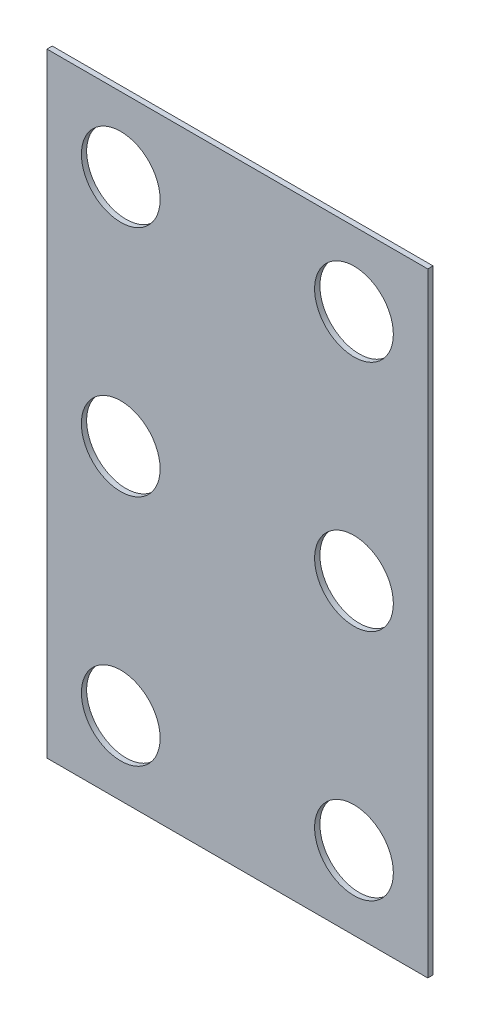
ISO-10303-21;
HEADER;
FILE_DESCRIPTION(('STEP AP214'),'2;1');
FILE_NAME('part.step','',(''),(''),'','','');
FILE_SCHEMA(('AUTOMOTIVE_DESIGN { 1 0 10303 214 1 1 1 1 }'));
ENDSEC;
DATA;
#1=APPLICATION_CONTEXT('core data for automotive mechanical design processes');
#2=APPLICATION_PROTOCOL_DEFINITION('international standard','automotive_design',2000,#1);
#3=PRODUCT_CONTEXT('',#1,'mechanical');
#4=PRODUCT('Part','Part','',(#3));
#5=PRODUCT_RELATED_PRODUCT_CATEGORY('part','',(#4));
#6=PRODUCT_DEFINITION_FORMATION('','',#4);
#7=PRODUCT_DEFINITION_CONTEXT('part definition',#1,'design');
#8=PRODUCT_DEFINITION('design','',#6,#7);
#9=PRODUCT_DEFINITION_SHAPE('','',#8);
#10=(LENGTH_UNIT() NAMED_UNIT(*) SI_UNIT(.MILLI.,.METRE.));
#11=(NAMED_UNIT(*) PLANE_ANGLE_UNIT() SI_UNIT($,.RADIAN.));
#12=(NAMED_UNIT(*) SI_UNIT($,.STERADIAN.) SOLID_ANGLE_UNIT());
#13=UNCERTAINTY_MEASURE_WITH_UNIT(LENGTH_MEASURE(1.E-05),#10,'distance_accuracy_value','');
#14=(GEOMETRIC_REPRESENTATION_CONTEXT(3) GLOBAL_UNCERTAINTY_ASSIGNED_CONTEXT((#13)) GLOBAL_UNIT_ASSIGNED_CONTEXT((#10,
#11,#12)) REPRESENTATION_CONTEXT('',''));
#15=CARTESIAN_POINT('',(0.,0.,0.));
#16=DIRECTION('',(0.,0.,1.));
#17=DIRECTION('',(1.,0.,0.));
#18=AXIS2_PLACEMENT_3D('',#15,#16,#17);
#19=CARTESIAN_POINT('',(0.,0.,0.46));
#20=DIRECTION('',(0.,0.,-1.));
#21=DIRECTION('',(-1.,0.,0.));
#22=AXIS2_PLACEMENT_3D('',#19,#20,#21);
#23=PLANE('',#22);
#24=DIRECTION('',(0.,-1.,0.));
#25=VECTOR('',#24,1.);
#26=CARTESIAN_POINT('',(0.,0.,0.46));
#27=LINE('',#26,#25);
#28=CARTESIAN_POINT('',(0.,53.5,0.46));
#29=VERTEX_POINT('',#28);
#30=CARTESIAN_POINT('',(0.,0.,0.46));
#31=VERTEX_POINT('',#30);
#32=EDGE_CURVE('E98',#29,#31,#27,.T.);
#33=ORIENTED_EDGE('',*,*,#32,.T.);
#34=DIRECTION('',(1.,0.,0.));
#35=VECTOR('',#34,1.);
#36=CARTESIAN_POINT('',(0.,0.,0.46));
#37=LINE('',#36,#35);
#38=CARTESIAN_POINT('',(33.18,0.,0.46));
#39=VERTEX_POINT('',#38);
#40=EDGE_CURVE('E93',#31,#39,#37,.T.);
#41=ORIENTED_EDGE('',*,*,#40,.T.);
#42=DIRECTION('',(0.,1.,0.));
#43=VECTOR('',#42,1.);
#44=CARTESIAN_POINT('',(33.18,0.,0.46));
#45=LINE('',#44,#43);
#46=CARTESIAN_POINT('',(33.18,53.5,0.46));
#47=VERTEX_POINT('',#46);
#48=EDGE_CURVE('E96',#39,#47,#45,.T.);
#49=ORIENTED_EDGE('',*,*,#48,.T.);
#50=DIRECTION('',(-1.,0.,0.));
#51=VECTOR('',#50,1.);
#52=CARTESIAN_POINT('',(0.,53.5,0.46));
#53=LINE('',#52,#51);
#54=EDGE_CURVE('E63',#47,#29,#53,.T.);
#55=ORIENTED_EDGE('',*,*,#54,.T.);
#56=EDGE_LOOP('',(#33,#41,#49,#55));
#57=FACE_BOUND('',#56,.T.);
#58=CARTESIAN_POINT('',(6.43,47.07,0.46));
#59=DIRECTION('',(0.,0.,1.));
#60=DIRECTION('',(1.,0.,0.));
#61=AXIS2_PLACEMENT_3D('',#58,#59,#60);
#62=CIRCLE('',#61,3.43);
#63=CARTESIAN_POINT('',(9.86,47.07,0.46));
#64=VERTEX_POINT('',#63);
#65=EDGE_CURVE('E118',#64,#64,#62,.T.);
#66=ORIENTED_EDGE('',*,*,#65,.F.);
#67=EDGE_LOOP('',(#66));
#68=FACE_BOUND('',#67,.T.);
#69=CARTESIAN_POINT('',(26.75,47.07,0.46));
#70=DIRECTION('',(0.,0.,1.));
#71=DIRECTION('',(1.,0.,0.));
#72=AXIS2_PLACEMENT_3D('',#69,#70,#71);
#73=CIRCLE('',#72,3.43);
#74=CARTESIAN_POINT('',(30.18,47.07,0.46));
#75=VERTEX_POINT('',#74);
#76=EDGE_CURVE('E140',#75,#75,#73,.T.);
#77=ORIENTED_EDGE('',*,*,#76,.F.);
#78=EDGE_LOOP('',(#77));
#79=FACE_BOUND('',#78,.T.);
#80=CARTESIAN_POINT('',(26.75,26.75,0.46));
#81=DIRECTION('',(0.,0.,1.));
#82=DIRECTION('',(1.,0.,0.));
#83=AXIS2_PLACEMENT_3D('',#80,#81,#82);
#84=CIRCLE('',#83,3.43);
#85=CARTESIAN_POINT('',(30.18,26.75,0.46));
#86=VERTEX_POINT('',#85);
#87=EDGE_CURVE('E148',#86,#86,#84,.T.);
#88=ORIENTED_EDGE('',*,*,#87,.F.);
#89=EDGE_LOOP('',(#88));
#90=FACE_BOUND('',#89,.T.);
#91=CARTESIAN_POINT('',(26.75,6.43000000000001,0.46));
#92=DIRECTION('',(0.,0.,1.));
#93=DIRECTION('',(1.,0.,0.));
#94=AXIS2_PLACEMENT_3D('',#91,#92,#93);
#95=CIRCLE('',#94,3.43);
#96=CARTESIAN_POINT('',(30.18,6.43000000000001,0.46));
#97=VERTEX_POINT('',#96);
#98=EDGE_CURVE('E156',#97,#97,#95,.T.);
#99=ORIENTED_EDGE('',*,*,#98,.F.);
#100=EDGE_LOOP('',(#99));
#101=FACE_BOUND('',#100,.T.);
#102=CARTESIAN_POINT('',(6.43000000000001,26.75,0.46));
#103=DIRECTION('',(0.,0.,1.));
#104=DIRECTION('',(1.,0.,0.));
#105=AXIS2_PLACEMENT_3D('',#102,#103,#104);
#106=CIRCLE('',#105,3.43);
#107=CARTESIAN_POINT('',(9.86000000000001,26.75,0.46));
#108=VERTEX_POINT('',#107);
#109=EDGE_CURVE('E164',#108,#108,#106,.T.);
#110=ORIENTED_EDGE('',*,*,#109,.F.);
#111=EDGE_LOOP('',(#110));
#112=FACE_BOUND('',#111,.T.);
#113=CARTESIAN_POINT('',(6.43000000000001,6.43000000000001,0.46));
#114=DIRECTION('',(0.,0.,1.));
#115=DIRECTION('',(1.,0.,0.));
#116=AXIS2_PLACEMENT_3D('',#113,#114,#115);
#117=CIRCLE('',#116,3.43);
#118=CARTESIAN_POINT('',(9.86000000000001,6.43000000000001,0.46));
#119=VERTEX_POINT('',#118);
#120=EDGE_CURVE('E172',#119,#119,#117,.T.);
#121=ORIENTED_EDGE('',*,*,#120,.F.);
#122=EDGE_LOOP('',(#121));
#123=FACE_BOUND('',#122,.T.);
#124=ADVANCED_FACE('F45',(#57,#68,#79,#90,#101,#112,#123),#23,.F.);
#125=CARTESIAN_POINT('',(0.,0.,0.));
#126=DIRECTION('',(0.,0.,-1.));
#127=DIRECTION('',(-1.,0.,0.));
#128=AXIS2_PLACEMENT_3D('',#125,#126,#127);
#129=PLANE('',#128);
#130=CARTESIAN_POINT('',(6.43000000000001,26.75,0.));
#131=DIRECTION('',(0.,0.,1.));
#132=DIRECTION('',(1.,0.,0.));
#133=AXIS2_PLACEMENT_3D('',#130,#131,#132);
#134=CIRCLE('',#133,3.43);
#135=CARTESIAN_POINT('',(9.86000000000001,26.75,0.));
#136=VERTEX_POINT('',#135);
#137=EDGE_CURVE('E168',#136,#136,#134,.T.);
#138=ORIENTED_EDGE('',*,*,#137,.T.);
#139=EDGE_LOOP('',(#138));
#140=FACE_BOUND('',#139,.T.);
#141=CARTESIAN_POINT('',(26.75,26.75,0.));
#142=DIRECTION('',(0.,0.,1.));
#143=DIRECTION('',(1.,0.,0.));
#144=AXIS2_PLACEMENT_3D('',#141,#142,#143);
#145=CIRCLE('',#144,3.43);
#146=CARTESIAN_POINT('',(30.18,26.75,0.));
#147=VERTEX_POINT('',#146);
#148=EDGE_CURVE('E152',#147,#147,#145,.T.);
#149=ORIENTED_EDGE('',*,*,#148,.T.);
#150=EDGE_LOOP('',(#149));
#151=FACE_BOUND('',#150,.T.);
#152=CARTESIAN_POINT('',(6.43,47.07,0.));
#153=DIRECTION('',(0.,0.,1.));
#154=DIRECTION('',(1.,0.,0.));
#155=AXIS2_PLACEMENT_3D('',#152,#153,#154);
#156=CIRCLE('',#155,3.43);
#157=CARTESIAN_POINT('',(9.86,47.07,0.));
#158=VERTEX_POINT('',#157);
#159=EDGE_CURVE('E136',#158,#158,#156,.T.);
#160=ORIENTED_EDGE('',*,*,#159,.T.);
#161=EDGE_LOOP('',(#160));
#162=FACE_BOUND('',#161,.T.);
#163=DIRECTION('',(0.,-1.,0.));
#164=VECTOR('',#163,1.);
#165=CARTESIAN_POINT('',(0.,0.,0.));
#166=LINE('',#165,#164);
#167=CARTESIAN_POINT('',(0.,53.5,0.));
#168=VERTEX_POINT('',#167);
#169=CARTESIAN_POINT('',(0.,0.,0.));
#170=VERTEX_POINT('',#169);
#171=EDGE_CURVE('E114',#168,#170,#166,.T.);
#172=ORIENTED_EDGE('',*,*,#171,.F.);
#173=DIRECTION('',(-1.,0.,0.));
#174=VECTOR('',#173,1.);
#175=CARTESIAN_POINT('',(0.,53.5,0.));
#176=LINE('',#175,#174);
#177=CARTESIAN_POINT('',(33.18,53.5,0.));
#178=VERTEX_POINT('',#177);
#179=EDGE_CURVE('E86',#178,#168,#176,.T.);
#180=ORIENTED_EDGE('',*,*,#179,.F.);
#181=DIRECTION('',(0.,1.,0.));
#182=VECTOR('',#181,1.);
#183=CARTESIAN_POINT('',(33.18,0.,0.));
#184=LINE('',#183,#182);
#185=CARTESIAN_POINT('',(33.18,0.,0.));
#186=VERTEX_POINT('',#185);
#187=EDGE_CURVE('E80',#186,#178,#184,.T.);
#188=ORIENTED_EDGE('',*,*,#187,.F.);
#189=DIRECTION('',(1.,0.,0.));
#190=VECTOR('',#189,1.);
#191=CARTESIAN_POINT('',(0.,0.,0.));
#192=LINE('',#191,#190);
#193=EDGE_CURVE('E103',#170,#186,#192,.T.);
#194=ORIENTED_EDGE('',*,*,#193,.F.);
#195=EDGE_LOOP('',(#172,#180,#188,#194));
#196=FACE_BOUND('',#195,.T.);
#197=CARTESIAN_POINT('',(26.75,47.07,0.));
#198=DIRECTION('',(0.,0.,1.));
#199=DIRECTION('',(1.,0.,0.));
#200=AXIS2_PLACEMENT_3D('',#197,#198,#199);
#201=CIRCLE('',#200,3.43);
#202=CARTESIAN_POINT('',(30.18,47.07,0.));
#203=VERTEX_POINT('',#202);
#204=EDGE_CURVE('E144',#203,#203,#201,.T.);
#205=ORIENTED_EDGE('',*,*,#204,.T.);
#206=EDGE_LOOP('',(#205));
#207=FACE_BOUND('',#206,.T.);
#208=CARTESIAN_POINT('',(26.75,6.43000000000001,0.));
#209=DIRECTION('',(0.,0.,1.));
#210=DIRECTION('',(1.,0.,0.));
#211=AXIS2_PLACEMENT_3D('',#208,#209,#210);
#212=CIRCLE('',#211,3.43);
#213=CARTESIAN_POINT('',(30.18,6.43000000000001,0.));
#214=VERTEX_POINT('',#213);
#215=EDGE_CURVE('E160',#214,#214,#212,.T.);
#216=ORIENTED_EDGE('',*,*,#215,.T.);
#217=EDGE_LOOP('',(#216));
#218=FACE_BOUND('',#217,.T.);
#219=CARTESIAN_POINT('',(6.43000000000001,6.43000000000001,0.));
#220=DIRECTION('',(0.,0.,1.));
#221=DIRECTION('',(1.,0.,0.));
#222=AXIS2_PLACEMENT_3D('',#219,#220,#221);
#223=CIRCLE('',#222,3.43);
#224=CARTESIAN_POINT('',(9.86000000000001,6.43000000000001,0.));
#225=VERTEX_POINT('',#224);
#226=EDGE_CURVE('E176',#225,#225,#223,.T.);
#227=ORIENTED_EDGE('',*,*,#226,.T.);
#228=EDGE_LOOP('',(#227));
#229=FACE_BOUND('',#228,.T.);
#230=ADVANCED_FACE('F131',(#140,#151,#162,#196,#207,#218,#229),#129,.T.);
#231=CARTESIAN_POINT('',(0.,0.,0.46));
#232=DIRECTION('',(1.,0.,0.));
#233=DIRECTION('',(0.,0.,-1.));
#234=AXIS2_PLACEMENT_3D('',#231,#232,#233);
#235=PLANE('',#234);
#236=ORIENTED_EDGE('',*,*,#171,.T.);
#237=DIRECTION('',(0.,0.,-1.));
#238=VECTOR('',#237,1.);
#239=CARTESIAN_POINT('',(0.,0.,0.46));
#240=LINE('',#239,#238);
#241=EDGE_CURVE('E11',#31,#170,#240,.T.);
#242=ORIENTED_EDGE('',*,*,#241,.F.);
#243=ORIENTED_EDGE('',*,*,#32,.F.);
#244=DIRECTION('',(0.,0.,-1.));
#245=VECTOR('',#244,1.);
#246=CARTESIAN_POINT('',(0.,53.5,0.46));
#247=LINE('',#246,#245);
#248=EDGE_CURVE('E110',#29,#168,#247,.T.);
#249=ORIENTED_EDGE('',*,*,#248,.T.);
#250=EDGE_LOOP('',(#236,#242,#243,#249));
#251=FACE_BOUND('',#250,.T.);
#252=ADVANCED_FACE('F47',(#251),#235,.F.);
#253=CARTESIAN_POINT('',(0.,0.,0.46));
#254=DIRECTION('',(0.,1.,0.));
#255=DIRECTION('',(-1.,0.,0.));
#256=AXIS2_PLACEMENT_3D('',#253,#254,#255);
#257=PLANE('',#256);
#258=ORIENTED_EDGE('',*,*,#193,.T.);
#259=DIRECTION('',(0.,0.,-1.));
#260=VECTOR('',#259,1.);
#261=CARTESIAN_POINT('',(33.18,0.,0.46));
#262=LINE('',#261,#260);
#263=EDGE_CURVE('E55',#39,#186,#262,.T.);
#264=ORIENTED_EDGE('',*,*,#263,.F.);
#265=ORIENTED_EDGE('',*,*,#40,.F.);
#266=ORIENTED_EDGE('',*,*,#241,.T.);
#267=EDGE_LOOP('',(#258,#264,#265,#266));
#268=FACE_BOUND('',#267,.T.);
#269=ADVANCED_FACE('F102',(#268),#257,.F.);
#270=CARTESIAN_POINT('',(33.18,0.,0.46));
#271=DIRECTION('',(-1.,0.,0.));
#272=DIRECTION('',(0.,-1.,0.));
#273=AXIS2_PLACEMENT_3D('',#270,#271,#272);
#274=PLANE('',#273);
#275=ORIENTED_EDGE('',*,*,#187,.T.);
#276=DIRECTION('',(0.,0.,-1.));
#277=VECTOR('',#276,1.);
#278=CARTESIAN_POINT('',(33.18,53.5,0.46));
#279=LINE('',#278,#277);
#280=EDGE_CURVE('E105',#47,#178,#279,.T.);
#281=ORIENTED_EDGE('',*,*,#280,.F.);
#282=ORIENTED_EDGE('',*,*,#48,.F.);
#283=ORIENTED_EDGE('',*,*,#263,.T.);
#284=EDGE_LOOP('',(#275,#281,#282,#283));
#285=FACE_BOUND('',#284,.T.);
#286=ADVANCED_FACE('F106',(#285),#274,.F.);
#287=CARTESIAN_POINT('',(0.,53.5,0.46));
#288=DIRECTION('',(0.,-1.,0.));
#289=DIRECTION('',(1.,0.,0.));
#290=AXIS2_PLACEMENT_3D('',#287,#288,#289);
#291=PLANE('',#290);
#292=ORIENTED_EDGE('',*,*,#179,.T.);
#293=ORIENTED_EDGE('',*,*,#248,.F.);
#294=ORIENTED_EDGE('',*,*,#54,.F.);
#295=ORIENTED_EDGE('',*,*,#280,.T.);
#296=EDGE_LOOP('',(#292,#293,#294,#295));
#297=FACE_BOUND('',#296,.T.);
#298=ADVANCED_FACE('F128',(#297),#291,.F.);
#299=CARTESIAN_POINT('',(6.43,47.07,0.46));
#300=DIRECTION('',(0.,0.,-1.));
#301=DIRECTION('',(-1.,0.,0.));
#302=AXIS2_PLACEMENT_3D('',#299,#300,#301);
#303=CYLINDRICAL_SURFACE('',#302,3.43);
#304=ORIENTED_EDGE('',*,*,#65,.T.);
#305=EDGE_LOOP('',(#304));
#306=FACE_BOUND('',#305,.T.);
#307=ORIENTED_EDGE('',*,*,#159,.F.);
#308=EDGE_LOOP('',(#307));
#309=FACE_BOUND('',#308,.T.);
#310=ADVANCED_FACE('F195',(#306,#309),#303,.F.);
#311=CARTESIAN_POINT('',(26.75,47.07,0.46));
#312=DIRECTION('',(0.,0.,-1.));
#313=DIRECTION('',(-1.,0.,0.));
#314=AXIS2_PLACEMENT_3D('',#311,#312,#313);
#315=CYLINDRICAL_SURFACE('',#314,3.43);
#316=ORIENTED_EDGE('',*,*,#76,.T.);
#317=EDGE_LOOP('',(#316));
#318=FACE_BOUND('',#317,.T.);
#319=ORIENTED_EDGE('',*,*,#204,.F.);
#320=EDGE_LOOP('',(#319));
#321=FACE_BOUND('',#320,.T.);
#322=ADVANCED_FACE('F240',(#318,#321),#315,.F.);
#323=CARTESIAN_POINT('',(26.75,26.75,0.46));
#324=DIRECTION('',(0.,0.,-1.));
#325=DIRECTION('',(-1.,0.,0.));
#326=AXIS2_PLACEMENT_3D('',#323,#324,#325);
#327=CYLINDRICAL_SURFACE('',#326,3.43);
#328=ORIENTED_EDGE('',*,*,#87,.T.);
#329=EDGE_LOOP('',(#328));
#330=FACE_BOUND('',#329,.T.);
#331=ORIENTED_EDGE('',*,*,#148,.F.);
#332=EDGE_LOOP('',(#331));
#333=FACE_BOUND('',#332,.T.);
#334=ADVANCED_FACE('F248',(#330,#333),#327,.F.);
#335=CARTESIAN_POINT('',(26.75,6.43000000000001,0.46));
#336=DIRECTION('',(0.,0.,-1.));
#337=DIRECTION('',(-1.,0.,0.));
#338=AXIS2_PLACEMENT_3D('',#335,#336,#337);
#339=CYLINDRICAL_SURFACE('',#338,3.43);
#340=ORIENTED_EDGE('',*,*,#98,.T.);
#341=EDGE_LOOP('',(#340));
#342=FACE_BOUND('',#341,.T.);
#343=ORIENTED_EDGE('',*,*,#215,.F.);
#344=EDGE_LOOP('',(#343));
#345=FACE_BOUND('',#344,.T.);
#346=ADVANCED_FACE('F256',(#342,#345),#339,.F.);
#347=CARTESIAN_POINT('',(6.43000000000001,26.75,0.46));
#348=DIRECTION('',(0.,0.,-1.));
#349=DIRECTION('',(-1.,0.,0.));
#350=AXIS2_PLACEMENT_3D('',#347,#348,#349);
#351=CYLINDRICAL_SURFACE('',#350,3.43);
#352=ORIENTED_EDGE('',*,*,#109,.T.);
#353=EDGE_LOOP('',(#352));
#354=FACE_BOUND('',#353,.T.);
#355=ORIENTED_EDGE('',*,*,#137,.F.);
#356=EDGE_LOOP('',(#355));
#357=FACE_BOUND('',#356,.T.);
#358=ADVANCED_FACE('F265',(#354,#357),#351,.F.);
#359=CARTESIAN_POINT('',(6.43000000000001,6.43000000000001,0.46));
#360=DIRECTION('',(0.,0.,-1.));
#361=DIRECTION('',(-1.,0.,0.));
#362=AXIS2_PLACEMENT_3D('',#359,#360,#361);
#363=CYLINDRICAL_SURFACE('',#362,3.43);
#364=ORIENTED_EDGE('',*,*,#120,.T.);
#365=EDGE_LOOP('',(#364));
#366=FACE_BOUND('',#365,.T.);
#367=ORIENTED_EDGE('',*,*,#226,.F.);
#368=EDGE_LOOP('',(#367));
#369=FACE_BOUND('',#368,.T.);
#370=ADVANCED_FACE('F184',(#366,#369),#363,.F.);
#371=CLOSED_SHELL('',(#124,#230,#252,#269,#286,#298,#310,#322,#334,#346,#358,#370));
#372=MANIFOLD_SOLID_BREP('B2',#371);
#373=ADVANCED_BREP_SHAPE_REPRESENTATION('',(#18,#372),#14);
#374=SHAPE_DEFINITION_REPRESENTATION(#9,#373);
ENDSEC;
END-ISO-10303-21;
